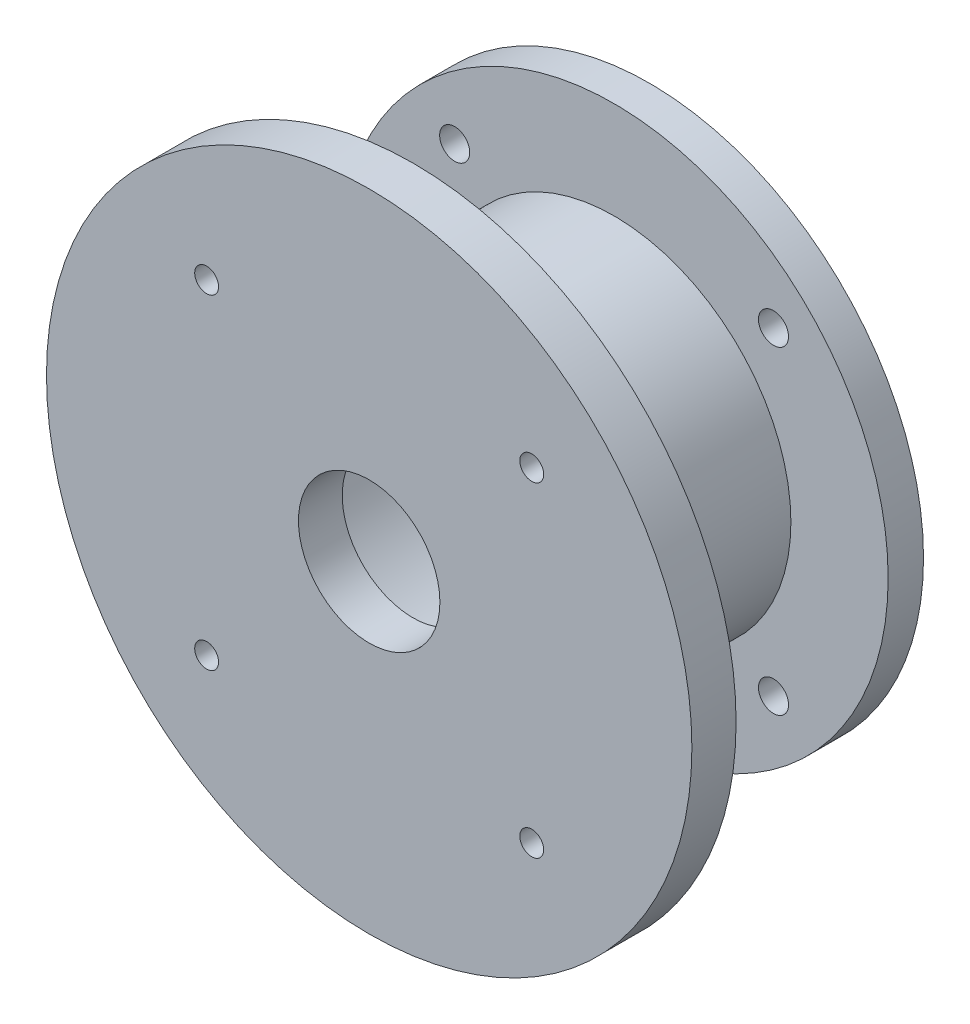
ISO-10303-21;
HEADER;
FILE_DESCRIPTION(('STEP AP214'),'2;1');
FILE_NAME('part.step','',(''),(''),'','','');
FILE_SCHEMA(('AUTOMOTIVE_DESIGN { 1 0 10303 214 1 1 1 1 }'));
ENDSEC;
DATA;
#1=APPLICATION_CONTEXT('core data for automotive mechanical design processes');
#2=APPLICATION_PROTOCOL_DEFINITION('international standard','automotive_design',2000,#1);
#3=PRODUCT_CONTEXT('',#1,'mechanical');
#4=PRODUCT('Part','Part','',(#3));
#5=PRODUCT_RELATED_PRODUCT_CATEGORY('part','',(#4));
#6=PRODUCT_DEFINITION_FORMATION('','',#4);
#7=PRODUCT_DEFINITION_CONTEXT('part definition',#1,'design');
#8=PRODUCT_DEFINITION('design','',#6,#7);
#9=PRODUCT_DEFINITION_SHAPE('','',#8);
#10=(LENGTH_UNIT() NAMED_UNIT(*) SI_UNIT(.MILLI.,.METRE.));
#11=(NAMED_UNIT(*) PLANE_ANGLE_UNIT() SI_UNIT($,.RADIAN.));
#12=(NAMED_UNIT(*) SI_UNIT($,.STERADIAN.) SOLID_ANGLE_UNIT());
#13=UNCERTAINTY_MEASURE_WITH_UNIT(LENGTH_MEASURE(1.E-05),#10,'distance_accuracy_value','');
#14=(GEOMETRIC_REPRESENTATION_CONTEXT(3) GLOBAL_UNCERTAINTY_ASSIGNED_CONTEXT((#13)) GLOBAL_UNIT_ASSIGNED_CONTEXT((#10,
#11,#12)) REPRESENTATION_CONTEXT('',''));
#15=CARTESIAN_POINT('',(0.,0.,0.));
#16=DIRECTION('',(0.,0.,1.));
#17=DIRECTION('',(1.,0.,0.));
#18=AXIS2_PLACEMENT_3D('',#15,#16,#17);
#19=CARTESIAN_POINT('',(120.,0.,131.7));
#20=DIRECTION('',(0.,0.,1.));
#21=DIRECTION('',(1.,0.,0.));
#22=AXIS2_PLACEMENT_3D('',#19,#20,#21);
#23=PLANE('',#22);
#24=CARTESIAN_POINT('',(138.38477631085,18.38477631085,131.7));
#25=DIRECTION('',(0.,0.,1.));
#26=DIRECTION('',(1.,0.,0.));
#27=AXIS2_PLACEMENT_3D('',#24,#25,#26);
#28=CIRCLE('',#27,1.35);
#29=CARTESIAN_POINT('',(139.73477631085,18.38477631085,131.7));
#30=VERTEX_POINT('',#29);
#31=EDGE_CURVE('E294',#30,#30,#28,.T.);
#32=ORIENTED_EDGE('',*,*,#31,.F.);
#33=EDGE_LOOP('',(#32));
#34=FACE_BOUND('',#33,.T.);
#35=CARTESIAN_POINT('',(101.61522368915,18.38477631085,131.7));
#36=DIRECTION('',(0.,0.,1.));
#37=DIRECTION('',(1.,0.,0.));
#38=AXIS2_PLACEMENT_3D('',#35,#36,#37);
#39=CIRCLE('',#38,1.35);
#40=CARTESIAN_POINT('',(102.96522368915,18.38477631085,131.7));
#41=VERTEX_POINT('',#40);
#42=EDGE_CURVE('E205',#41,#41,#39,.T.);
#43=ORIENTED_EDGE('',*,*,#42,.F.);
#44=EDGE_LOOP('',(#43));
#45=FACE_BOUND('',#44,.T.);
#46=CARTESIAN_POINT('',(120.,0.,131.7));
#47=DIRECTION('',(0.,0.,1.));
#48=DIRECTION('',(1.,0.,0.));
#49=AXIS2_PLACEMENT_3D('',#46,#47,#48);
#50=CIRCLE('',#49,8.);
#51=CARTESIAN_POINT('',(128.,0.,131.7));
#52=VERTEX_POINT('',#51);
#53=EDGE_CURVE('E9',#52,#52,#50,.T.);
#54=ORIENTED_EDGE('',*,*,#53,.F.);
#55=EDGE_LOOP('',(#54));
#56=FACE_BOUND('',#55,.T.);
#57=CARTESIAN_POINT('',(138.38477631085,-18.38477631085,131.7));
#58=DIRECTION('',(0.,0.,1.));
#59=DIRECTION('',(1.,0.,0.));
#60=AXIS2_PLACEMENT_3D('',#57,#58,#59);
#61=CIRCLE('',#60,1.35);
#62=CARTESIAN_POINT('',(139.73477631085,-18.38477631085,131.7));
#63=VERTEX_POINT('',#62);
#64=EDGE_CURVE('E191',#63,#63,#61,.T.);
#65=ORIENTED_EDGE('',*,*,#64,.F.);
#66=EDGE_LOOP('',(#65));
#67=FACE_BOUND('',#66,.T.);
#68=CARTESIAN_POINT('',(101.61522368915,-18.38477631085,131.7));
#69=DIRECTION('',(0.,0.,1.));
#70=DIRECTION('',(1.,0.,0.));
#71=AXIS2_PLACEMENT_3D('',#68,#69,#70);
#72=CIRCLE('',#71,1.35);
#73=CARTESIAN_POINT('',(102.96522368915,-18.38477631085,131.7));
#74=VERTEX_POINT('',#73);
#75=EDGE_CURVE('E208',#74,#74,#72,.T.);
#76=ORIENTED_EDGE('',*,*,#75,.F.);
#77=EDGE_LOOP('',(#76));
#78=FACE_BOUND('',#77,.T.);
#79=CARTESIAN_POINT('',(120.,0.,131.7));
#80=DIRECTION('',(0.,0.,1.));
#81=DIRECTION('',(1.,0.,0.));
#82=AXIS2_PLACEMENT_3D('',#79,#80,#81);
#83=CIRCLE('',#82,36.5);
#84=CARTESIAN_POINT('',(156.5,0.,131.7));
#85=VERTEX_POINT('',#84);
#86=EDGE_CURVE('E276',#85,#85,#83,.T.);
#87=ORIENTED_EDGE('',*,*,#86,.T.);
#88=EDGE_LOOP('',(#87));
#89=FACE_BOUND('',#88,.T.);
#90=ADVANCED_FACE('F14',(#34,#45,#56,#67,#78,#89),#23,.T.);
#91=CARTESIAN_POINT('',(120.,0.,126.6));
#92=DIRECTION('',(0.,0.,1.));
#93=DIRECTION('',(1.,0.,0.));
#94=AXIS2_PLACEMENT_3D('',#91,#92,#93);
#95=CYLINDRICAL_SURFACE('',#94,8.);
#96=DIRECTION('',(0.,0.,1.));
#97=VECTOR('',#96,1.);
#98=CARTESIAN_POINT('',(128.,0.,126.6));
#99=LINE('',#98,#97);
#100=CARTESIAN_POINT('',(128.,0.,126.75));
#101=VERTEX_POINT('',#100);
#102=EDGE_CURVE('E25',#101,#52,#99,.T.);
#103=ORIENTED_EDGE('',*,*,#102,.F.);
#104=CARTESIAN_POINT('',(120.,0.,126.75));
#105=DIRECTION('',(0.,0.,1.));
#106=DIRECTION('',(1.,0.,0.));
#107=AXIS2_PLACEMENT_3D('',#104,#105,#106);
#108=CIRCLE('',#107,8.);
#109=EDGE_CURVE('E272',#101,#101,#108,.T.);
#110=ORIENTED_EDGE('',*,*,#109,.F.);
#111=ORIENTED_EDGE('',*,*,#102,.T.);
#112=ORIENTED_EDGE('',*,*,#53,.T.);
#113=EDGE_LOOP('',(#103,#110,#111,#112));
#114=FACE_BOUND('',#113,.T.);
#115=ADVANCED_FACE('F518',(#114),#95,.F.);
#116=CARTESIAN_POINT('',(138.38477631085,18.38477631085,126.6));
#117=DIRECTION('',(0.,0.,1.));
#118=DIRECTION('',(1.,0.,0.));
#119=AXIS2_PLACEMENT_3D('',#116,#117,#118);
#120=CYLINDRICAL_SURFACE('',#119,1.35);
#121=DIRECTION('',(0.,0.,1.));
#122=VECTOR('',#121,1.);
#123=CARTESIAN_POINT('',(139.73477631085,18.38477631085,126.6));
#124=LINE('',#123,#122);
#125=CARTESIAN_POINT('',(139.73477631085,18.38477631085,126.7));
#126=VERTEX_POINT('',#125);
#127=EDGE_CURVE('E215',#126,#30,#124,.T.);
#128=ORIENTED_EDGE('',*,*,#127,.F.);
#129=CARTESIAN_POINT('',(138.38477631085,18.38477631085,126.7));
#130=DIRECTION('',(0.,0.,1.));
#131=DIRECTION('',(1.,0.,0.));
#132=AXIS2_PLACEMENT_3D('',#129,#130,#131);
#133=CIRCLE('',#132,1.35);
#134=EDGE_CURVE('E271',#126,#126,#133,.T.);
#135=ORIENTED_EDGE('',*,*,#134,.F.);
#136=ORIENTED_EDGE('',*,*,#127,.T.);
#137=ORIENTED_EDGE('',*,*,#31,.T.);
#138=EDGE_LOOP('',(#128,#135,#136,#137));
#139=FACE_BOUND('',#138,.T.);
#140=ADVANCED_FACE('F524',(#139),#120,.F.);
#141=CARTESIAN_POINT('',(101.61522368915,18.38477631085,126.6));
#142=DIRECTION('',(0.,0.,1.));
#143=DIRECTION('',(1.,0.,0.));
#144=AXIS2_PLACEMENT_3D('',#141,#142,#143);
#145=CYLINDRICAL_SURFACE('',#144,1.35);
#146=DIRECTION('',(0.,0.,1.));
#147=VECTOR('',#146,1.);
#148=CARTESIAN_POINT('',(102.96522368915,18.38477631085,126.6));
#149=LINE('',#148,#147);
#150=CARTESIAN_POINT('',(102.96522368915,18.38477631085,126.7));
#151=VERTEX_POINT('',#150);
#152=EDGE_CURVE('E198',#151,#41,#149,.T.);
#153=ORIENTED_EDGE('',*,*,#152,.F.);
#154=CARTESIAN_POINT('',(101.61522368915,18.38477631085,126.7));
#155=DIRECTION('',(0.,0.,1.));
#156=DIRECTION('',(1.,0.,0.));
#157=AXIS2_PLACEMENT_3D('',#154,#155,#156);
#158=CIRCLE('',#157,1.35);
#159=EDGE_CURVE('E245',#151,#151,#158,.T.);
#160=ORIENTED_EDGE('',*,*,#159,.F.);
#161=ORIENTED_EDGE('',*,*,#152,.T.);
#162=ORIENTED_EDGE('',*,*,#42,.T.);
#163=EDGE_LOOP('',(#153,#160,#161,#162));
#164=FACE_BOUND('',#163,.T.);
#165=ADVANCED_FACE('F563',(#164),#145,.F.);
#166=CARTESIAN_POINT('',(138.38477631085,-18.38477631085,126.6));
#167=DIRECTION('',(0.,0.,1.));
#168=DIRECTION('',(1.,0.,0.));
#169=AXIS2_PLACEMENT_3D('',#166,#167,#168);
#170=CYLINDRICAL_SURFACE('',#169,1.35);
#171=DIRECTION('',(0.,0.,1.));
#172=VECTOR('',#171,1.);
#173=CARTESIAN_POINT('',(139.73477631085,-18.38477631085,126.6));
#174=LINE('',#173,#172);
#175=CARTESIAN_POINT('',(139.73477631085,-18.38477631085,126.7));
#176=VERTEX_POINT('',#175);
#177=EDGE_CURVE('E194',#176,#63,#174,.T.);
#178=ORIENTED_EDGE('',*,*,#177,.F.);
#179=CARTESIAN_POINT('',(138.38477631085,-18.38477631085,126.7));
#180=DIRECTION('',(0.,0.,1.));
#181=DIRECTION('',(1.,0.,0.));
#182=AXIS2_PLACEMENT_3D('',#179,#180,#181);
#183=CIRCLE('',#182,1.35);
#184=EDGE_CURVE('E242',#176,#176,#183,.T.);
#185=ORIENTED_EDGE('',*,*,#184,.F.);
#186=ORIENTED_EDGE('',*,*,#177,.T.);
#187=ORIENTED_EDGE('',*,*,#64,.T.);
#188=EDGE_LOOP('',(#178,#185,#186,#187));
#189=FACE_BOUND('',#188,.T.);
#190=ADVANCED_FACE('F192',(#189),#170,.F.);
#191=CARTESIAN_POINT('',(101.61522368915,-18.38477631085,126.6));
#192=DIRECTION('',(0.,0.,1.));
#193=DIRECTION('',(1.,0.,0.));
#194=AXIS2_PLACEMENT_3D('',#191,#192,#193);
#195=CYLINDRICAL_SURFACE('',#194,1.35);
#196=DIRECTION('',(0.,0.,1.));
#197=VECTOR('',#196,1.);
#198=CARTESIAN_POINT('',(102.96522368915,-18.38477631085,126.6));
#199=LINE('',#198,#197);
#200=CARTESIAN_POINT('',(102.96522368915,-18.38477631085,126.7));
#201=VERTEX_POINT('',#200);
#202=EDGE_CURVE('E401',#201,#74,#199,.T.);
#203=ORIENTED_EDGE('',*,*,#202,.F.);
#204=CARTESIAN_POINT('',(101.61522368915,-18.38477631085,126.7));
#205=DIRECTION('',(0.,0.,1.));
#206=DIRECTION('',(1.,0.,0.));
#207=AXIS2_PLACEMENT_3D('',#204,#205,#206);
#208=CIRCLE('',#207,1.35);
#209=EDGE_CURVE('E246',#201,#201,#208,.T.);
#210=ORIENTED_EDGE('',*,*,#209,.F.);
#211=ORIENTED_EDGE('',*,*,#202,.T.);
#212=ORIENTED_EDGE('',*,*,#75,.T.);
#213=EDGE_LOOP('',(#203,#210,#211,#212));
#214=FACE_BOUND('',#213,.T.);
#215=ADVANCED_FACE('F570',(#214),#195,.F.);
#216=CARTESIAN_POINT('',(120.,0.,126.7));
#217=DIRECTION('',(0.,0.,1.));
#218=DIRECTION('',(1.,0.,0.));
#219=AXIS2_PLACEMENT_3D('',#216,#217,#218);
#220=CYLINDRICAL_SURFACE('',#219,36.5);
#221=ORIENTED_EDGE('',*,*,#86,.F.);
#222=DIRECTION('',(0.,0.,1.));
#223=VECTOR('',#222,1.);
#224=CARTESIAN_POINT('',(156.5,0.,126.7));
#225=LINE('',#224,#223);
#226=CARTESIAN_POINT('',(156.5,0.,126.7));
#227=VERTEX_POINT('',#226);
#228=EDGE_CURVE('E288',#227,#85,#225,.T.);
#229=ORIENTED_EDGE('',*,*,#228,.F.);
#230=CARTESIAN_POINT('',(120.,0.,126.7));
#231=DIRECTION('',(0.,0.,1.));
#232=DIRECTION('',(1.,0.,0.));
#233=AXIS2_PLACEMENT_3D('',#230,#231,#232);
#234=CIRCLE('',#233,36.5);
#235=EDGE_CURVE('E258',#227,#227,#234,.T.);
#236=ORIENTED_EDGE('',*,*,#235,.T.);
#237=ORIENTED_EDGE('',*,*,#228,.T.);
#238=EDGE_LOOP('',(#221,#229,#236,#237));
#239=FACE_BOUND('',#238,.T.);
#240=ADVANCED_FACE('F556',(#239),#220,.T.);
#241=CARTESIAN_POINT('',(120.,0.,126.75));
#242=DIRECTION('',(0.,0.,1.));
#243=DIRECTION('',(1.,0.,0.));
#244=AXIS2_PLACEMENT_3D('',#241,#242,#243);
#245=PLANE('',#244);
#246=ORIENTED_EDGE('',*,*,#109,.T.);
#247=EDGE_LOOP('',(#246));
#248=FACE_BOUND('',#247,.T.);
#249=CARTESIAN_POINT('',(120.,0.,126.75));
#250=DIRECTION('',(0.,0.,1.));
#251=DIRECTION('',(1.,0.,0.));
#252=AXIS2_PLACEMENT_3D('',#249,#250,#251);
#253=CIRCLE('',#252,17.);
#254=CARTESIAN_POINT('',(137.,0.,126.75));
#255=VERTEX_POINT('',#254);
#256=EDGE_CURVE('E308',#255,#255,#253,.T.);
#257=ORIENTED_EDGE('',*,*,#256,.F.);
#258=EDGE_LOOP('',(#257));
#259=FACE_BOUND('',#258,.T.);
#260=ADVANCED_FACE('F550',(#248,#259),#245,.F.);
#261=CARTESIAN_POINT('',(104.,-6.,101.7));
#262=DIRECTION('',(1.,0.,0.));
#263=DIRECTION('',(0.,1.,0.));
#264=AXIS2_PLACEMENT_3D('',#261,#262,#263);
#265=PLANE('',#264);
#266=DIRECTION('',(0.,0.,1.));
#267=VECTOR('',#266,1.);
#268=CARTESIAN_POINT('',(104.,6.,101.7));
#269=LINE('',#268,#267);
#270=CARTESIAN_POINT('',(104.,6.,101.7));
#271=VERTEX_POINT('',#270);
#272=CARTESIAN_POINT('',(104.,6.,126.7));
#273=VERTEX_POINT('',#272);
#274=EDGE_CURVE('E226',#271,#273,#269,.T.);
#275=ORIENTED_EDGE('',*,*,#274,.F.);
#276=DIRECTION('',(0.,1.,0.));
#277=VECTOR('',#276,1.);
#278=CARTESIAN_POINT('',(104.,-6.,101.7));
#279=LINE('',#278,#277);
#280=CARTESIAN_POINT('',(104.,5.744562646538,101.7));
#281=VERTEX_POINT('',#280);
#282=EDGE_CURVE('E270',#281,#271,#279,.T.);
#283=ORIENTED_EDGE('',*,*,#282,.F.);
#284=DIRECTION('',(0.,0.,1.));
#285=VECTOR('',#284,1.);
#286=CARTESIAN_POINT('',(104.,5.744562646538,99.95));
#287=LINE('',#286,#285);
#288=CARTESIAN_POINT('',(104.,5.744562646538,126.7));
#289=VERTEX_POINT('',#288);
#290=EDGE_CURVE('E307',#281,#289,#287,.T.);
#291=ORIENTED_EDGE('',*,*,#290,.T.);
#292=DIRECTION('',(0.,1.,0.));
#293=VECTOR('',#292,1.);
#294=CARTESIAN_POINT('',(104.,-6.,126.7));
#295=LINE('',#294,#293);
#296=EDGE_CURVE('E266',#289,#273,#295,.T.);
#297=ORIENTED_EDGE('',*,*,#296,.T.);
#298=EDGE_LOOP('',(#275,#283,#291,#297));
#299=FACE_BOUND('',#298,.T.);
#300=ADVANCED_FACE('F418',(#299),#265,.F.);
#301=CARTESIAN_POINT('',(99.,-6.,101.7));
#302=DIRECTION('',(0.,0.,1.));
#303=DIRECTION('',(1.,0.,0.));
#304=AXIS2_PLACEMENT_3D('',#301,#302,#303);
#305=PLANE('',#304);
#306=DIRECTION('',(1.,0.,0.));
#307=VECTOR('',#306,1.);
#308=CARTESIAN_POINT('',(99.,6.,101.7));
#309=LINE('',#308,#307);
#310=CARTESIAN_POINT('',(99.,6.,101.7));
#311=VERTEX_POINT('',#310);
#312=EDGE_CURVE('E259',#311,#271,#309,.T.);
#313=ORIENTED_EDGE('',*,*,#312,.F.);
#314=DIRECTION('',(0.,1.,0.));
#315=VECTOR('',#314,1.);
#316=CARTESIAN_POINT('',(99.,-6.,101.7));
#317=LINE('',#316,#315);
#318=CARTESIAN_POINT('',(99.,-6.,101.7));
#319=VERTEX_POINT('',#318);
#320=EDGE_CURVE('E237',#319,#311,#317,.T.);
#321=ORIENTED_EDGE('',*,*,#320,.F.);
#322=DIRECTION('',(1.,0.,0.));
#323=VECTOR('',#322,1.);
#324=CARTESIAN_POINT('',(99.,-6.,101.7));
#325=LINE('',#324,#323);
#326=CARTESIAN_POINT('',(104.,-6.,101.7));
#327=VERTEX_POINT('',#326);
#328=EDGE_CURVE('E235',#319,#327,#325,.T.);
#329=ORIENTED_EDGE('',*,*,#328,.T.);
#330=DIRECTION('',(0.,1.,0.));
#331=VECTOR('',#330,1.);
#332=CARTESIAN_POINT('',(104.,-6.,101.7));
#333=LINE('',#332,#331);
#334=CARTESIAN_POINT('',(104.,-5.744562646538,101.7));
#335=VERTEX_POINT('',#334);
#336=EDGE_CURVE('E267',#327,#335,#333,.T.);
#337=ORIENTED_EDGE('',*,*,#336,.T.);
#338=CARTESIAN_POINT('',(120.,0.,101.7));
#339=DIRECTION('',(0.,0.,1.));
#340=DIRECTION('',(1.,0.,0.));
#341=AXIS2_PLACEMENT_3D('',#338,#339,#340);
#342=CIRCLE('',#341,17.);
#343=EDGE_CURVE('E332',#281,#335,#342,.T.);
#344=ORIENTED_EDGE('',*,*,#343,.F.);
#345=ORIENTED_EDGE('',*,*,#282,.T.);
#346=EDGE_LOOP('',(#313,#321,#329,#337,#344,#345));
#347=FACE_BOUND('',#346,.T.);
#348=ADVANCED_FACE('F413',(#347),#305,.T.);
#349=CARTESIAN_POINT('',(104.,-6.,101.7));
#350=DIRECTION('',(1.,0.,0.));
#351=DIRECTION('',(0.,1.,0.));
#352=AXIS2_PLACEMENT_3D('',#349,#350,#351);
#353=PLANE('',#352);
#354=DIRECTION('',(0.,0.,1.));
#355=VECTOR('',#354,1.);
#356=CARTESIAN_POINT('',(104.,-5.744562646538,99.95));
#357=LINE('',#356,#355);
#358=CARTESIAN_POINT('',(104.,-5.744562646538,126.7));
#359=VERTEX_POINT('',#358);
#360=EDGE_CURVE('E336',#335,#359,#357,.T.);
#361=ORIENTED_EDGE('',*,*,#360,.F.);
#362=ORIENTED_EDGE('',*,*,#336,.F.);
#363=DIRECTION('',(0.,0.,1.));
#364=VECTOR('',#363,1.);
#365=CARTESIAN_POINT('',(104.,-6.,101.7));
#366=LINE('',#365,#364);
#367=CARTESIAN_POINT('',(104.,-6.,126.7));
#368=VERTEX_POINT('',#367);
#369=EDGE_CURVE('E302',#327,#368,#366,.T.);
#370=ORIENTED_EDGE('',*,*,#369,.T.);
#371=DIRECTION('',(0.,1.,0.));
#372=VECTOR('',#371,1.);
#373=CARTESIAN_POINT('',(104.,-6.,126.7));
#374=LINE('',#373,#372);
#375=EDGE_CURVE('E379',#368,#359,#374,.T.);
#376=ORIENTED_EDGE('',*,*,#375,.T.);
#377=EDGE_LOOP('',(#361,#362,#370,#376));
#378=FACE_BOUND('',#377,.T.);
#379=ADVANCED_FACE('F434',(#378),#353,.F.);
#380=CARTESIAN_POINT('',(120.,0.,126.7));
#381=DIRECTION('',(0.,0.,1.));
#382=DIRECTION('',(1.,0.,0.));
#383=AXIS2_PLACEMENT_3D('',#380,#381,#382);
#384=PLANE('',#383);
#385=ORIENTED_EDGE('',*,*,#134,.T.);
#386=EDGE_LOOP('',(#385));
#387=FACE_BOUND('',#386,.T.);
#388=DIRECTION('',(1.,0.,0.));
#389=VECTOR('',#388,1.);
#390=CARTESIAN_POINT('',(99.,6.,126.7));
#391=LINE('',#390,#389);
#392=CARTESIAN_POINT('',(100.92121597166,6.,126.7));
#393=VERTEX_POINT('',#392);
#394=EDGE_CURVE('E18',#393,#273,#391,.T.);
#395=ORIENTED_EDGE('',*,*,#394,.T.);
#396=ORIENTED_EDGE('',*,*,#296,.F.);
#397=CARTESIAN_POINT('',(120.,0.,126.7));
#398=DIRECTION('',(0.,0.,1.));
#399=DIRECTION('',(1.,0.,0.));
#400=AXIS2_PLACEMENT_3D('',#397,#398,#399);
#401=CIRCLE('',#400,17.);
#402=EDGE_CURVE('E303',#289,#359,#401,.T.);
#403=ORIENTED_EDGE('',*,*,#402,.T.);
#404=ORIENTED_EDGE('',*,*,#375,.F.);
#405=DIRECTION('',(1.,0.,0.));
#406=VECTOR('',#405,1.);
#407=CARTESIAN_POINT('',(99.,-6.,126.7));
#408=LINE('',#407,#406);
#409=CARTESIAN_POINT('',(100.92121597166,-6.,126.7));
#410=VERTEX_POINT('',#409);
#411=EDGE_CURVE('E234',#410,#368,#408,.T.);
#412=ORIENTED_EDGE('',*,*,#411,.F.);
#413=CARTESIAN_POINT('',(120.,0.,126.7));
#414=DIRECTION('',(0.,0.,-1.));
#415=DIRECTION('',(-0.953939201416951,0.299999999999985,0.));
#416=AXIS2_PLACEMENT_3D('',#413,#414,#415);
#417=CIRCLE('',#416,20.);
#418=EDGE_CURVE('E254',#393,#410,#417,.T.);
#419=ORIENTED_EDGE('',*,*,#418,.F.);
#420=EDGE_LOOP('',(#395,#396,#403,#404,#412,#419));
#421=FACE_BOUND('',#420,.T.);
#422=ORIENTED_EDGE('',*,*,#159,.T.);
#423=EDGE_LOOP('',(#422));
#424=FACE_BOUND('',#423,.T.);
#425=ORIENTED_EDGE('',*,*,#184,.T.);
#426=EDGE_LOOP('',(#425));
#427=FACE_BOUND('',#426,.T.);
#428=ORIENTED_EDGE('',*,*,#209,.T.);
#429=EDGE_LOOP('',(#428));
#430=FACE_BOUND('',#429,.T.);
#431=ORIENTED_EDGE('',*,*,#235,.F.);
#432=EDGE_LOOP('',(#431));
#433=FACE_BOUND('',#432,.T.);
#434=ADVANCED_FACE('F449',(#387,#421,#424,#427,#430,#433),#384,.F.);
#435=CARTESIAN_POINT('',(120.,0.,99.95));
#436=DIRECTION('',(0.,0.,1.));
#437=DIRECTION('',(1.,0.,0.));
#438=AXIS2_PLACEMENT_3D('',#435,#436,#437);
#439=CYLINDRICAL_SURFACE('',#438,17.);
#440=ORIENTED_EDGE('',*,*,#402,.F.);
#441=ORIENTED_EDGE('',*,*,#290,.F.);
#442=ORIENTED_EDGE('',*,*,#343,.T.);
#443=ORIENTED_EDGE('',*,*,#360,.T.);
#444=EDGE_LOOP('',(#440,#441,#442,#443));
#445=FACE_BOUND('',#444,.T.);
#446=DIRECTION('',(0.,0.,1.));
#447=VECTOR('',#446,1.);
#448=CARTESIAN_POINT('',(137.,0.,99.95));
#449=LINE('',#448,#447);
#450=CARTESIAN_POINT('',(137.,0.,100.));
#451=VERTEX_POINT('',#450);
#452=EDGE_CURVE('E225',#451,#255,#449,.T.);
#453=ORIENTED_EDGE('',*,*,#452,.T.);
#454=ORIENTED_EDGE('',*,*,#256,.T.);
#455=ORIENTED_EDGE('',*,*,#452,.F.);
#456=CARTESIAN_POINT('',(120.,0.,100.));
#457=DIRECTION('',(0.,0.,1.));
#458=DIRECTION('',(1.,0.,0.));
#459=AXIS2_PLACEMENT_3D('',#456,#457,#458);
#460=CIRCLE('',#459,17.);
#461=EDGE_CURVE('E317',#451,#451,#460,.T.);
#462=ORIENTED_EDGE('',*,*,#461,.F.);
#463=EDGE_LOOP('',(#453,#454,#455,#462));
#464=FACE_BOUND('',#463,.T.);
#465=ADVANCED_FACE('F16',(#445,#464),#439,.F.);
#466=CARTESIAN_POINT('',(138.03122292025,18.031222920257,99.9));
#467=DIRECTION('',(0.,0.,1.));
#468=DIRECTION('',(1.,0.,0.));
#469=AXIS2_PLACEMENT_3D('',#466,#467,#468);
#470=CYLINDRICAL_SURFACE('',#469,1.7);
#471=DIRECTION('',(0.,0.,1.));
#472=VECTOR('',#471,1.);
#473=CARTESIAN_POINT('',(139.73122292025,18.031222920257,99.9));
#474=LINE('',#473,#472);
#475=CARTESIAN_POINT('',(139.73122292025,18.031222920257,100.));
#476=VERTEX_POINT('',#475);
#477=CARTESIAN_POINT('',(139.73122292025,18.031222920257,104.));
#478=VERTEX_POINT('',#477);
#479=EDGE_CURVE('E222',#476,#478,#474,.T.);
#480=ORIENTED_EDGE('',*,*,#479,.F.);
#481=CARTESIAN_POINT('',(138.03122292025,18.031222920257,100.));
#482=DIRECTION('',(0.,0.,1.));
#483=DIRECTION('',(1.,0.,0.));
#484=AXIS2_PLACEMENT_3D('',#481,#482,#483);
#485=CIRCLE('',#484,1.7);
#486=EDGE_CURVE('E340',#476,#476,#485,.T.);
#487=ORIENTED_EDGE('',*,*,#486,.F.);
#488=ORIENTED_EDGE('',*,*,#479,.T.);
#489=CARTESIAN_POINT('',(138.03122292025,18.031222920257,104.));
#490=DIRECTION('',(0.,0.,1.));
#491=DIRECTION('',(1.,0.,0.));
#492=AXIS2_PLACEMENT_3D('',#489,#490,#491);
#493=CIRCLE('',#492,1.7);
#494=EDGE_CURVE('E221',#478,#478,#493,.T.);
#495=ORIENTED_EDGE('',*,*,#494,.T.);
#496=EDGE_LOOP('',(#480,#487,#488,#495));
#497=FACE_BOUND('',#496,.T.);
#498=ADVANCED_FACE('F532',(#497),#470,.F.);
#499=CARTESIAN_POINT('',(99.,6.,101.7));
#500=DIRECTION('',(0.,1.,0.));
#501=DIRECTION('',(1.,0.,0.));
#502=AXIS2_PLACEMENT_3D('',#499,#500,#501);
#503=PLANE('',#502);
#504=ORIENTED_EDGE('',*,*,#394,.F.);
#505=DIRECTION('',(0.,0.,1.));
#506=VECTOR('',#505,1.);
#507=CARTESIAN_POINT('',(100.92121597166,6.,100.));
#508=LINE('',#507,#506);
#509=CARTESIAN_POINT('',(100.92121597166,6.,104.));
#510=VERTEX_POINT('',#509);
#511=EDGE_CURVE('E284',#510,#393,#508,.T.);
#512=ORIENTED_EDGE('',*,*,#511,.F.);
#513=DIRECTION('',(-1.,0.,0.));
#514=VECTOR('',#513,1.);
#515=CARTESIAN_POINT('',(109.5,6.,104.));
#516=LINE('',#515,#514);
#517=CARTESIAN_POINT('',(99.,6.,104.));
#518=VERTEX_POINT('',#517);
#519=EDGE_CURVE('E212',#510,#518,#516,.T.);
#520=ORIENTED_EDGE('',*,*,#519,.T.);
#521=DIRECTION('',(0.,0.,1.));
#522=VECTOR('',#521,1.);
#523=CARTESIAN_POINT('',(99.,6.,101.7));
#524=LINE('',#523,#522);
#525=EDGE_CURVE('E241',#311,#518,#524,.T.);
#526=ORIENTED_EDGE('',*,*,#525,.F.);
#527=ORIENTED_EDGE('',*,*,#312,.T.);
#528=ORIENTED_EDGE('',*,*,#274,.T.);
#529=EDGE_LOOP('',(#504,#512,#520,#526,#527,#528));
#530=FACE_BOUND('',#529,.T.);
#531=ADVANCED_FACE('F421',(#530),#503,.F.);
#532=CARTESIAN_POINT('',(99.,-6.,101.7));
#533=DIRECTION('',(1.,0.,0.));
#534=DIRECTION('',(0.,1.,0.));
#535=AXIS2_PLACEMENT_3D('',#532,#533,#534);
#536=PLANE('',#535);
#537=DIRECTION('',(0.,0.,1.));
#538=VECTOR('',#537,1.);
#539=CARTESIAN_POINT('',(99.,-6.,101.7));
#540=LINE('',#539,#538);
#541=CARTESIAN_POINT('',(99.,-6.,104.));
#542=VERTEX_POINT('',#541);
#543=EDGE_CURVE('E232',#319,#542,#540,.T.);
#544=ORIENTED_EDGE('',*,*,#543,.F.);
#545=ORIENTED_EDGE('',*,*,#320,.T.);
#546=ORIENTED_EDGE('',*,*,#525,.T.);
#547=DIRECTION('',(0.,1.,0.));
#548=VECTOR('',#547,1.);
#549=CARTESIAN_POINT('',(99.,-3.,104.));
#550=LINE('',#549,#548);
#551=EDGE_CURVE('E227',#542,#518,#550,.T.);
#552=ORIENTED_EDGE('',*,*,#551,.F.);
#553=EDGE_LOOP('',(#544,#545,#546,#552));
#554=FACE_BOUND('',#553,.T.);
#555=ADVANCED_FACE('F427',(#554),#536,.T.);
#556=CARTESIAN_POINT('',(99.,-6.,101.7));
#557=DIRECTION('',(0.,1.,0.));
#558=DIRECTION('',(1.,0.,0.));
#559=AXIS2_PLACEMENT_3D('',#556,#557,#558);
#560=PLANE('',#559);
#561=ORIENTED_EDGE('',*,*,#369,.F.);
#562=ORIENTED_EDGE('',*,*,#328,.F.);
#563=ORIENTED_EDGE('',*,*,#543,.T.);
#564=DIRECTION('',(-1.,0.,0.));
#565=VECTOR('',#564,1.);
#566=CARTESIAN_POINT('',(109.5,-6.,104.));
#567=LINE('',#566,#565);
#568=CARTESIAN_POINT('',(100.92121597166,-6.,104.));
#569=VERTEX_POINT('',#568);
#570=EDGE_CURVE('E231',#569,#542,#567,.T.);
#571=ORIENTED_EDGE('',*,*,#570,.F.);
#572=DIRECTION('',(0.,0.,1.));
#573=VECTOR('',#572,1.);
#574=CARTESIAN_POINT('',(100.92121597166,-6.,100.));
#575=LINE('',#574,#573);
#576=EDGE_CURVE('E280',#569,#410,#575,.T.);
#577=ORIENTED_EDGE('',*,*,#576,.T.);
#578=ORIENTED_EDGE('',*,*,#411,.T.);
#579=EDGE_LOOP('',(#561,#562,#563,#571,#577,#578));
#580=FACE_BOUND('',#579,.T.);
#581=ADVANCED_FACE('F432',(#580),#560,.T.);
#582=CARTESIAN_POINT('',(120.,0.,100.));
#583=DIRECTION('',(0.,0.,1.));
#584=DIRECTION('',(1.,0.,0.));
#585=AXIS2_PLACEMENT_3D('',#582,#583,#584);
#586=CYLINDRICAL_SURFACE('',#585,20.);
#587=ORIENTED_EDGE('',*,*,#418,.T.);
#588=ORIENTED_EDGE('',*,*,#576,.F.);
#589=CARTESIAN_POINT('',(120.,0.,104.));
#590=DIRECTION('',(0.,0.,-1.));
#591=DIRECTION('',(-0.953939201416951,0.299999999999985,0.));
#592=AXIS2_PLACEMENT_3D('',#589,#590,#591);
#593=CIRCLE('',#592,20.);
#594=EDGE_CURVE('E331',#510,#569,#593,.T.);
#595=ORIENTED_EDGE('',*,*,#594,.F.);
#596=ORIENTED_EDGE('',*,*,#511,.T.);
#597=EDGE_LOOP('',(#587,#588,#595,#596));
#598=FACE_BOUND('',#597,.T.);
#599=ADVANCED_FACE('F447',(#598),#586,.T.);
#600=CARTESIAN_POINT('',(101.96877707974,18.031222920257,99.9));
#601=DIRECTION('',(0.,0.,1.));
#602=DIRECTION('',(1.,0.,0.));
#603=AXIS2_PLACEMENT_3D('',#600,#601,#602);
#604=CYLINDRICAL_SURFACE('',#603,1.7);
#605=DIRECTION('',(0.,0.,1.));
#606=VECTOR('',#605,1.);
#607=CARTESIAN_POINT('',(103.66877707974,18.031222920257,99.9));
#608=LINE('',#607,#606);
#609=CARTESIAN_POINT('',(103.66877707974,18.031222920257,100.));
#610=VERTEX_POINT('',#609);
#611=CARTESIAN_POINT('',(103.66877707974,18.031222920257,104.));
#612=VERTEX_POINT('',#611);
#613=EDGE_CURVE('E250',#610,#612,#608,.T.);
#614=ORIENTED_EDGE('',*,*,#613,.F.);
#615=CARTESIAN_POINT('',(101.96877707974,18.031222920257,100.));
#616=DIRECTION('',(0.,0.,1.));
#617=DIRECTION('',(1.,0.,0.));
#618=AXIS2_PLACEMENT_3D('',#615,#616,#617);
#619=CIRCLE('',#618,1.7);
#620=EDGE_CURVE('E298',#610,#610,#619,.T.);
#621=ORIENTED_EDGE('',*,*,#620,.F.);
#622=ORIENTED_EDGE('',*,*,#613,.T.);
#623=CARTESIAN_POINT('',(101.96877707974,18.031222920257,104.));
#624=DIRECTION('',(0.,0.,1.));
#625=DIRECTION('',(1.,0.,0.));
#626=AXIS2_PLACEMENT_3D('',#623,#624,#625);
#627=CIRCLE('',#626,1.7);
#628=EDGE_CURVE('E346',#612,#612,#627,.T.);
#629=ORIENTED_EDGE('',*,*,#628,.T.);
#630=EDGE_LOOP('',(#614,#621,#622,#629));
#631=FACE_BOUND('',#630,.T.);
#632=ADVANCED_FACE('F553',(#631),#604,.F.);
#633=CARTESIAN_POINT('',(138.03122292025,-18.03122292025,99.9));
#634=DIRECTION('',(0.,0.,1.));
#635=DIRECTION('',(1.,0.,0.));
#636=AXIS2_PLACEMENT_3D('',#633,#634,#635);
#637=CYLINDRICAL_SURFACE('',#636,1.7);
#638=DIRECTION('',(0.,0.,1.));
#639=VECTOR('',#638,1.);
#640=CARTESIAN_POINT('',(139.73122292025,-18.03122292025,99.9));
#641=LINE('',#640,#639);
#642=CARTESIAN_POINT('',(139.73122292025,-18.03122292025,100.));
#643=VERTEX_POINT('',#642);
#644=CARTESIAN_POINT('',(139.73122292025,-18.03122292025,104.));
#645=VERTEX_POINT('',#644);
#646=EDGE_CURVE('E247',#643,#645,#641,.T.);
#647=ORIENTED_EDGE('',*,*,#646,.F.);
#648=CARTESIAN_POINT('',(138.03122292025,-18.03122292025,100.));
#649=DIRECTION('',(0.,0.,1.));
#650=DIRECTION('',(1.,0.,0.));
#651=AXIS2_PLACEMENT_3D('',#648,#649,#650);
#652=CIRCLE('',#651,1.7);
#653=EDGE_CURVE('E220',#643,#643,#652,.T.);
#654=ORIENTED_EDGE('',*,*,#653,.F.);
#655=ORIENTED_EDGE('',*,*,#646,.T.);
#656=CARTESIAN_POINT('',(138.03122292025,-18.03122292025,104.));
#657=DIRECTION('',(0.,0.,1.));
#658=DIRECTION('',(1.,0.,0.));
#659=AXIS2_PLACEMENT_3D('',#656,#657,#658);
#660=CIRCLE('',#659,1.7);
#661=EDGE_CURVE('E343',#645,#645,#660,.T.);
#662=ORIENTED_EDGE('',*,*,#661,.T.);
#663=EDGE_LOOP('',(#647,#654,#655,#662));
#664=FACE_BOUND('',#663,.T.);
#665=ADVANCED_FACE('F513',(#664),#637,.F.);
#666=CARTESIAN_POINT('',(101.96877707974,-18.03122292025,99.9));
#667=DIRECTION('',(0.,0.,1.));
#668=DIRECTION('',(1.,0.,0.));
#669=AXIS2_PLACEMENT_3D('',#666,#667,#668);
#670=CYLINDRICAL_SURFACE('',#669,1.7);
#671=DIRECTION('',(0.,0.,1.));
#672=VECTOR('',#671,1.);
#673=CARTESIAN_POINT('',(103.66877707974,-18.03122292025,99.9));
#674=LINE('',#673,#672);
#675=CARTESIAN_POINT('',(103.66877707974,-18.03122292025,100.));
#676=VERTEX_POINT('',#675);
#677=CARTESIAN_POINT('',(103.66877707974,-18.03122292025,104.));
#678=VERTEX_POINT('',#677);
#679=EDGE_CURVE('E251',#676,#678,#674,.T.);
#680=ORIENTED_EDGE('',*,*,#679,.F.);
#681=CARTESIAN_POINT('',(101.96877707974,-18.03122292025,100.));
#682=DIRECTION('',(0.,0.,1.));
#683=DIRECTION('',(1.,0.,0.));
#684=AXIS2_PLACEMENT_3D('',#681,#682,#683);
#685=CIRCLE('',#684,1.7);
#686=EDGE_CURVE('E216',#676,#676,#685,.T.);
#687=ORIENTED_EDGE('',*,*,#686,.F.);
#688=ORIENTED_EDGE('',*,*,#679,.T.);
#689=CARTESIAN_POINT('',(101.96877707974,-18.03122292025,104.));
#690=DIRECTION('',(0.,0.,1.));
#691=DIRECTION('',(1.,0.,0.));
#692=AXIS2_PLACEMENT_3D('',#689,#690,#691);
#693=CIRCLE('',#692,1.7);
#694=EDGE_CURVE('E347',#678,#678,#693,.T.);
#695=ORIENTED_EDGE('',*,*,#694,.T.);
#696=EDGE_LOOP('',(#680,#687,#688,#695));
#697=FACE_BOUND('',#696,.T.);
#698=ADVANCED_FACE('F506',(#697),#670,.F.);
#699=CARTESIAN_POINT('',(120.,0.,100.));
#700=DIRECTION('',(0.,0.,1.));
#701=DIRECTION('',(1.,0.,0.));
#702=AXIS2_PLACEMENT_3D('',#699,#700,#701);
#703=PLANE('',#702);
#704=ORIENTED_EDGE('',*,*,#486,.T.);
#705=EDGE_LOOP('',(#704));
#706=FACE_BOUND('',#705,.T.);
#707=ORIENTED_EDGE('',*,*,#461,.T.);
#708=EDGE_LOOP('',(#707));
#709=FACE_BOUND('',#708,.T.);
#710=ORIENTED_EDGE('',*,*,#620,.T.);
#711=EDGE_LOOP('',(#710));
#712=FACE_BOUND('',#711,.T.);
#713=ORIENTED_EDGE('',*,*,#653,.T.);
#714=EDGE_LOOP('',(#713));
#715=FACE_BOUND('',#714,.T.);
#716=ORIENTED_EDGE('',*,*,#686,.T.);
#717=EDGE_LOOP('',(#716));
#718=FACE_BOUND('',#717,.T.);
#719=CARTESIAN_POINT('',(120.,0.,100.));
#720=DIRECTION('',(0.,0.,1.));
#721=DIRECTION('',(1.,0.,0.));
#722=AXIS2_PLACEMENT_3D('',#719,#720,#721);
#723=CIRCLE('',#722,31.);
#724=CARTESIAN_POINT('',(151.,0.,100.));
#725=VERTEX_POINT('',#724);
#726=EDGE_CURVE('E327',#725,#725,#723,.T.);
#727=ORIENTED_EDGE('',*,*,#726,.F.);
#728=EDGE_LOOP('',(#727));
#729=FACE_BOUND('',#728,.T.);
#730=ADVANCED_FACE('F493',(#706,#709,#712,#715,#718,#729),#703,.F.);
#731=CARTESIAN_POINT('',(120.,0.,104.));
#732=DIRECTION('',(0.,0.,1.));
#733=DIRECTION('',(1.,0.,0.));
#734=AXIS2_PLACEMENT_3D('',#731,#732,#733);
#735=PLANE('',#734);
#736=ORIENTED_EDGE('',*,*,#494,.F.);
#737=EDGE_LOOP('',(#736));
#738=FACE_BOUND('',#737,.T.);
#739=ORIENTED_EDGE('',*,*,#594,.T.);
#740=ORIENTED_EDGE('',*,*,#570,.T.);
#741=ORIENTED_EDGE('',*,*,#551,.T.);
#742=ORIENTED_EDGE('',*,*,#519,.F.);
#743=EDGE_LOOP('',(#739,#740,#741,#742));
#744=FACE_BOUND('',#743,.T.);
#745=ORIENTED_EDGE('',*,*,#628,.F.);
#746=EDGE_LOOP('',(#745));
#747=FACE_BOUND('',#746,.T.);
#748=ORIENTED_EDGE('',*,*,#661,.F.);
#749=EDGE_LOOP('',(#748));
#750=FACE_BOUND('',#749,.T.);
#751=ORIENTED_EDGE('',*,*,#694,.F.);
#752=EDGE_LOOP('',(#751));
#753=FACE_BOUND('',#752,.T.);
#754=CARTESIAN_POINT('',(120.,0.,104.));
#755=DIRECTION('',(0.,0.,1.));
#756=DIRECTION('',(1.,0.,0.));
#757=AXIS2_PLACEMENT_3D('',#754,#755,#756);
#758=CIRCLE('',#757,31.);
#759=CARTESIAN_POINT('',(151.,0.,104.));
#760=VERTEX_POINT('',#759);
#761=EDGE_CURVE('E318',#760,#760,#758,.T.);
#762=ORIENTED_EDGE('',*,*,#761,.T.);
#763=EDGE_LOOP('',(#762));
#764=FACE_BOUND('',#763,.T.);
#765=ADVANCED_FACE('F453',(#738,#744,#747,#750,#753,#764),#735,.T.);
#766=CARTESIAN_POINT('',(120.,0.,100.));
#767=DIRECTION('',(0.,0.,1.));
#768=DIRECTION('',(1.,0.,0.));
#769=AXIS2_PLACEMENT_3D('',#766,#767,#768);
#770=CYLINDRICAL_SURFACE('',#769,31.);
#771=ORIENTED_EDGE('',*,*,#761,.F.);
#772=DIRECTION('',(0.,0.,1.));
#773=VECTOR('',#772,1.);
#774=CARTESIAN_POINT('',(151.,0.,100.));
#775=LINE('',#774,#773);
#776=EDGE_CURVE('E322',#725,#760,#775,.T.);
#777=ORIENTED_EDGE('',*,*,#776,.F.);
#778=ORIENTED_EDGE('',*,*,#726,.T.);
#779=ORIENTED_EDGE('',*,*,#776,.T.);
#780=EDGE_LOOP('',(#771,#777,#778,#779));
#781=FACE_BOUND('',#780,.T.);
#782=ADVANCED_FACE('F492',(#781),#770,.T.);
#783=CLOSED_SHELL('',(#90,#115,#140,#165,#190,#215,#240,#260,#300,#348,#379,#434,#465,#498,#531,
#555,#581,#599,#632,#665,#698,#730,#765,#782));
#784=MANIFOLD_SOLID_BREP('B1',#783);
#785=ADVANCED_BREP_SHAPE_REPRESENTATION('',(#18,#784),#14);
#786=SHAPE_DEFINITION_REPRESENTATION(#9,#785);
ENDSEC;
END-ISO-10303-21;
